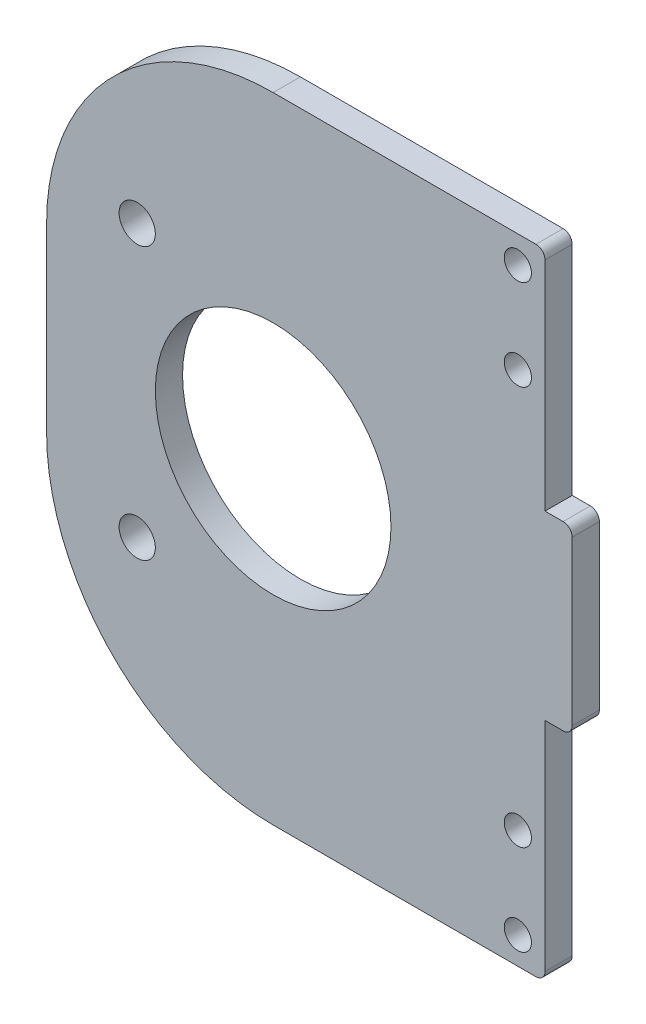
ISO-10303-21;
HEADER;
FILE_DESCRIPTION(('STEP AP214'),'2;1');
FILE_NAME('part.step','',(''),(''),'','','');
FILE_SCHEMA(('AUTOMOTIVE_DESIGN { 1 0 10303 214 1 1 1 1 }'));
ENDSEC;
DATA;
#1=APPLICATION_CONTEXT('core data for automotive mechanical design processes');
#2=APPLICATION_PROTOCOL_DEFINITION('international standard','automotive_design',2000,#1);
#3=PRODUCT_CONTEXT('',#1,'mechanical');
#4=PRODUCT('Part','Part','',(#3));
#5=PRODUCT_RELATED_PRODUCT_CATEGORY('part','',(#4));
#6=PRODUCT_DEFINITION_FORMATION('','',#4);
#7=PRODUCT_DEFINITION_CONTEXT('part definition',#1,'design');
#8=PRODUCT_DEFINITION('design','',#6,#7);
#9=PRODUCT_DEFINITION_SHAPE('','',#8);
#10=(LENGTH_UNIT() NAMED_UNIT(*) SI_UNIT(.MILLI.,.METRE.));
#11=(NAMED_UNIT(*) PLANE_ANGLE_UNIT() SI_UNIT($,.RADIAN.));
#12=(NAMED_UNIT(*) SI_UNIT($,.STERADIAN.) SOLID_ANGLE_UNIT());
#13=UNCERTAINTY_MEASURE_WITH_UNIT(LENGTH_MEASURE(1.E-05),#10,'distance_accuracy_value','');
#14=(GEOMETRIC_REPRESENTATION_CONTEXT(3) GLOBAL_UNCERTAINTY_ASSIGNED_CONTEXT((#13)) GLOBAL_UNIT_ASSIGNED_CONTEXT((#10,
#11,#12)) REPRESENTATION_CONTEXT('',''));
#15=CARTESIAN_POINT('',(0.,0.,0.));
#16=DIRECTION('',(0.,0.,1.));
#17=DIRECTION('',(1.,0.,0.));
#18=AXIS2_PLACEMENT_3D('',#15,#16,#17);
#19=CARTESIAN_POINT('',(27.5,-35.,3.));
#20=DIRECTION('',(-1.,0.,0.));
#21=DIRECTION('',(0.,0.,1.));
#22=AXIS2_PLACEMENT_3D('',#19,#20,#21);
#23=PLANE('',#22);
#24=DIRECTION('',(0.,1.,0.));
#25=VECTOR('',#24,1.);
#26=CARTESIAN_POINT('',(27.5,-35.,0.));
#27=LINE('',#26,#25);
#28=CARTESIAN_POINT('',(27.5,10.,0.));
#29=VERTEX_POINT('',#28);
#30=CARTESIAN_POINT('',(27.5,34.,0.));
#31=VERTEX_POINT('',#30);
#32=EDGE_CURVE('E168',#29,#31,#27,.T.);
#33=ORIENTED_EDGE('',*,*,#32,.T.);
#34=DIRECTION('',(0.,0.,-1.));
#35=VECTOR('',#34,1.);
#36=CARTESIAN_POINT('',(27.5,34.,3.));
#37=LINE('',#36,#35);
#38=CARTESIAN_POINT('',(27.5,34.,3.));
#39=VERTEX_POINT('',#38);
#40=EDGE_CURVE('E211',#31,#39,#37,.F.);
#41=ORIENTED_EDGE('',*,*,#40,.T.);
#42=DIRECTION('',(0.,1.,0.));
#43=VECTOR('',#42,1.);
#44=CARTESIAN_POINT('',(27.5,-35.,3.));
#45=LINE('',#44,#43);
#46=CARTESIAN_POINT('',(27.5,10.,3.));
#47=VERTEX_POINT('',#46);
#48=EDGE_CURVE('E169',#47,#39,#45,.T.);
#49=ORIENTED_EDGE('',*,*,#48,.F.);
#50=DIRECTION('',(0.,0.,1.));
#51=VECTOR('',#50,1.);
#52=CARTESIAN_POINT('',(27.5,10.,0.));
#53=LINE('',#52,#51);
#54=EDGE_CURVE('E152',#29,#47,#53,.T.);
#55=ORIENTED_EDGE('',*,*,#54,.F.);
#56=EDGE_LOOP('',(#33,#41,#49,#55));
#57=FACE_BOUND('',#56,.T.);
#58=ADVANCED_FACE('F44',(#57),#23,.F.);
#59=CARTESIAN_POINT('',(27.5,-34.,3.));
#60=VERTEX_POINT('',#59);
#61=CARTESIAN_POINT('',(27.5,-10.,3.));
#62=VERTEX_POINT('',#61);
#63=EDGE_CURVE('E298',#60,#62,#45,.T.);
#64=ORIENTED_EDGE('',*,*,#63,.F.);
#65=DIRECTION('',(0.,0.,-1.));
#66=VECTOR('',#65,1.);
#67=CARTESIAN_POINT('',(27.5,-34.,3.));
#68=LINE('',#67,#66);
#69=CARTESIAN_POINT('',(27.5,-34.,0.));
#70=VERTEX_POINT('',#69);
#71=EDGE_CURVE('E229',#60,#70,#68,.T.);
#72=ORIENTED_EDGE('',*,*,#71,.T.);
#73=CARTESIAN_POINT('',(27.5,-10.,0.));
#74=VERTEX_POINT('',#73);
#75=EDGE_CURVE('E178',#70,#74,#27,.T.);
#76=ORIENTED_EDGE('',*,*,#75,.T.);
#77=DIRECTION('',(0.,0.,1.));
#78=VECTOR('',#77,1.);
#79=CARTESIAN_POINT('',(27.5,-10.,0.));
#80=LINE('',#79,#78);
#81=EDGE_CURVE('E171',#74,#62,#80,.T.);
#82=ORIENTED_EDGE('',*,*,#81,.T.);
#83=EDGE_LOOP('',(#64,#72,#76,#82));
#84=FACE_BOUND('',#83,.T.);
#85=ADVANCED_FACE('F415',(#84),#23,.F.);
#86=CARTESIAN_POINT('',(-27.5,35.,3.));
#87=DIRECTION('',(0.,-1.,0.));
#88=DIRECTION('',(0.,0.,-1.));
#89=AXIS2_PLACEMENT_3D('',#86,#87,#88);
#90=PLANE('',#89);
#91=DIRECTION('',(-1.,0.,0.));
#92=VECTOR('',#91,1.);
#93=CARTESIAN_POINT('',(-27.5,35.,0.));
#94=LINE('',#93,#92);
#95=CARTESIAN_POINT('',(26.5,35.,0.));
#96=VERTEX_POINT('',#95);
#97=CARTESIAN_POINT('',(-2.5,35.,0.));
#98=VERTEX_POINT('',#97);
#99=EDGE_CURVE('E182',#96,#98,#94,.T.);
#100=ORIENTED_EDGE('',*,*,#99,.T.);
#101=DIRECTION('',(0.,0.,-1.));
#102=VECTOR('',#101,1.);
#103=CARTESIAN_POINT('',(-2.5,35.,3.));
#104=LINE('',#103,#102);
#105=CARTESIAN_POINT('',(-2.5,35.,3.));
#106=VERTEX_POINT('',#105);
#107=EDGE_CURVE('E11',#98,#106,#104,.F.);
#108=ORIENTED_EDGE('',*,*,#107,.T.);
#109=DIRECTION('',(-1.,0.,0.));
#110=VECTOR('',#109,1.);
#111=CARTESIAN_POINT('',(-27.5,35.,3.));
#112=LINE('',#111,#110);
#113=CARTESIAN_POINT('',(26.5,35.,3.));
#114=VERTEX_POINT('',#113);
#115=EDGE_CURVE('E287',#114,#106,#112,.T.);
#116=ORIENTED_EDGE('',*,*,#115,.F.);
#117=DIRECTION('',(0.,0.,-1.));
#118=VECTOR('',#117,1.);
#119=CARTESIAN_POINT('',(26.5,35.,3.));
#120=LINE('',#119,#118);
#121=EDGE_CURVE('E198',#114,#96,#120,.T.);
#122=ORIENTED_EDGE('',*,*,#121,.T.);
#123=EDGE_LOOP('',(#100,#108,#116,#122));
#124=FACE_BOUND('',#123,.T.);
#125=ADVANCED_FACE('F286',(#124),#90,.F.);
#126=CARTESIAN_POINT('',(-27.5,-35.,3.));
#127=DIRECTION('',(1.,0.,0.));
#128=DIRECTION('',(0.,0.,-1.));
#129=AXIS2_PLACEMENT_3D('',#126,#127,#128);
#130=PLANE('',#129);
#131=DIRECTION('',(0.,-1.,0.));
#132=VECTOR('',#131,1.);
#133=CARTESIAN_POINT('',(-27.5,-35.,0.));
#134=LINE('',#133,#132);
#135=CARTESIAN_POINT('',(-27.5,10.,0.));
#136=VERTEX_POINT('',#135);
#137=CARTESIAN_POINT('',(-27.5,-9.99999999999999,0.));
#138=VERTEX_POINT('',#137);
#139=EDGE_CURVE('E192',#136,#138,#134,.T.);
#140=ORIENTED_EDGE('',*,*,#139,.T.);
#141=DIRECTION('',(0.,0.,-1.));
#142=VECTOR('',#141,1.);
#143=CARTESIAN_POINT('',(-27.5,-9.99999999999999,3.));
#144=LINE('',#143,#142);
#145=CARTESIAN_POINT('',(-27.5,-9.99999999999999,3.));
#146=VERTEX_POINT('',#145);
#147=EDGE_CURVE('E70',#138,#146,#144,.F.);
#148=ORIENTED_EDGE('',*,*,#147,.T.);
#149=DIRECTION('',(0.,-1.,0.));
#150=VECTOR('',#149,1.);
#151=CARTESIAN_POINT('',(-27.5,-35.,3.));
#152=LINE('',#151,#150);
#153=CARTESIAN_POINT('',(-27.5,10.,3.));
#154=VERTEX_POINT('',#153);
#155=EDGE_CURVE('E274',#154,#146,#152,.T.);
#156=ORIENTED_EDGE('',*,*,#155,.F.);
#157=DIRECTION('',(0.,0.,-1.));
#158=VECTOR('',#157,1.);
#159=CARTESIAN_POINT('',(-27.5,10.,3.));
#160=LINE('',#159,#158);
#161=EDGE_CURVE('E261',#154,#136,#160,.T.);
#162=ORIENTED_EDGE('',*,*,#161,.T.);
#163=EDGE_LOOP('',(#140,#148,#156,#162));
#164=FACE_BOUND('',#163,.T.);
#165=ADVANCED_FACE('F283',(#164),#130,.F.);
#166=CARTESIAN_POINT('',(-27.5,-35.,3.));
#167=DIRECTION('',(0.,1.,0.));
#168=DIRECTION('',(0.,0.,1.));
#169=AXIS2_PLACEMENT_3D('',#166,#167,#168);
#170=PLANE('',#169);
#171=DIRECTION('',(1.,0.,0.));
#172=VECTOR('',#171,1.);
#173=CARTESIAN_POINT('',(-27.5,-35.,3.));
#174=LINE('',#173,#172);
#175=CARTESIAN_POINT('',(-2.5,-35.,3.));
#176=VERTEX_POINT('',#175);
#177=CARTESIAN_POINT('',(26.5,-35.,3.));
#178=VERTEX_POINT('',#177);
#179=EDGE_CURVE('E186',#176,#178,#174,.T.);
#180=ORIENTED_EDGE('',*,*,#179,.F.);
#181=DIRECTION('',(0.,0.,-1.));
#182=VECTOR('',#181,1.);
#183=CARTESIAN_POINT('',(-2.5,-35.,3.));
#184=LINE('',#183,#182);
#185=CARTESIAN_POINT('',(-2.5,-35.,0.));
#186=VERTEX_POINT('',#185);
#187=EDGE_CURVE('E252',#176,#186,#184,.T.);
#188=ORIENTED_EDGE('',*,*,#187,.T.);
#189=DIRECTION('',(1.,0.,0.));
#190=VECTOR('',#189,1.);
#191=CARTESIAN_POINT('',(-27.5,-35.,0.));
#192=LINE('',#191,#190);
#193=CARTESIAN_POINT('',(26.5,-35.,0.));
#194=VERTEX_POINT('',#193);
#195=EDGE_CURVE('E196',#186,#194,#192,.T.);
#196=ORIENTED_EDGE('',*,*,#195,.T.);
#197=DIRECTION('',(0.,0.,-1.));
#198=VECTOR('',#197,1.);
#199=CARTESIAN_POINT('',(26.5,-35.,3.));
#200=LINE('',#199,#198);
#201=EDGE_CURVE('E234',#194,#178,#200,.F.);
#202=ORIENTED_EDGE('',*,*,#201,.T.);
#203=EDGE_LOOP('',(#180,#188,#196,#202));
#204=FACE_BOUND('',#203,.T.);
#205=ADVANCED_FACE('F277',(#204),#170,.F.);
#206=CARTESIAN_POINT('',(0.,0.,3.));
#207=DIRECTION('',(0.,0.,-1.));
#208=DIRECTION('',(-1.,0.,0.));
#209=AXIS2_PLACEMENT_3D('',#206,#207,#208);
#210=PLANE('',#209);
#211=CARTESIAN_POINT('',(-17.5,15.,3.));
#212=DIRECTION('',(0.,0.,-1.));
#213=DIRECTION('',(-1.,0.,0.));
#214=AXIS2_PLACEMENT_3D('',#211,#212,#213);
#215=CIRCLE('',#214,2.);
#216=CARTESIAN_POINT('',(-19.5,15.,3.));
#217=VERTEX_POINT('',#216);
#218=EDGE_CURVE('E353',#217,#217,#215,.T.);
#219=ORIENTED_EDGE('',*,*,#218,.T.);
#220=EDGE_LOOP('',(#219));
#221=FACE_BOUND('',#220,.T.);
#222=CARTESIAN_POINT('',(-17.5,-15.,3.));
#223=DIRECTION('',(0.,0.,-1.));
#224=DIRECTION('',(1.,0.,0.));
#225=AXIS2_PLACEMENT_3D('',#222,#223,#224);
#226=CIRCLE('',#225,2.);
#227=CARTESIAN_POINT('',(-15.5,-15.,3.));
#228=VERTEX_POINT('',#227);
#229=EDGE_CURVE('E356',#228,#228,#226,.T.);
#230=ORIENTED_EDGE('',*,*,#229,.T.);
#231=EDGE_LOOP('',(#230));
#232=FACE_BOUND('',#231,.T.);
#233=CARTESIAN_POINT('',(24.5,32.,3.));
#234=DIRECTION('',(0.,0.,1.));
#235=DIRECTION('',(1.,0.,0.));
#236=AXIS2_PLACEMENT_3D('',#233,#234,#235);
#237=CIRCLE('',#236,1.5);
#238=CARTESIAN_POINT('',(26.,32.,3.));
#239=VERTEX_POINT('',#238);
#240=EDGE_CURVE('E333',#239,#239,#237,.T.);
#241=ORIENTED_EDGE('',*,*,#240,.F.);
#242=EDGE_LOOP('',(#241));
#243=FACE_BOUND('',#242,.T.);
#244=CARTESIAN_POINT('',(24.5,22.,3.));
#245=DIRECTION('',(0.,0.,1.));
#246=DIRECTION('',(1.,0.,0.));
#247=AXIS2_PLACEMENT_3D('',#244,#245,#246);
#248=CIRCLE('',#247,1.5);
#249=CARTESIAN_POINT('',(26.,22.,3.));
#250=VERTEX_POINT('',#249);
#251=EDGE_CURVE('E330',#250,#250,#248,.T.);
#252=ORIENTED_EDGE('',*,*,#251,.F.);
#253=EDGE_LOOP('',(#252));
#254=FACE_BOUND('',#253,.T.);
#255=CARTESIAN_POINT('',(24.5,-22.,3.));
#256=DIRECTION('',(0.,0.,1.));
#257=DIRECTION('',(-1.,0.,0.));
#258=AXIS2_PLACEMENT_3D('',#255,#256,#257);
#259=CIRCLE('',#258,1.5);
#260=CARTESIAN_POINT('',(23.,-22.,3.));
#261=VERTEX_POINT('',#260);
#262=EDGE_CURVE('E316',#261,#261,#259,.T.);
#263=ORIENTED_EDGE('',*,*,#262,.F.);
#264=EDGE_LOOP('',(#263));
#265=FACE_BOUND('',#264,.T.);
#266=CARTESIAN_POINT('',(24.5,-32.,3.));
#267=DIRECTION('',(0.,0.,1.));
#268=DIRECTION('',(-1.,0.,0.));
#269=AXIS2_PLACEMENT_3D('',#266,#267,#268);
#270=CIRCLE('',#269,1.5);
#271=CARTESIAN_POINT('',(23.,-32.,3.));
#272=VERTEX_POINT('',#271);
#273=EDGE_CURVE('E311',#272,#272,#270,.T.);
#274=ORIENTED_EDGE('',*,*,#273,.F.);
#275=EDGE_LOOP('',(#274));
#276=FACE_BOUND('',#275,.T.);
#277=CARTESIAN_POINT('',(-2.49999999999999,0.,3.));
#278=DIRECTION('',(0.,0.,-1.));
#279=DIRECTION('',(-1.,0.,0.));
#280=AXIS2_PLACEMENT_3D('',#277,#278,#279);
#281=CIRCLE('',#280,13.);
#282=CARTESIAN_POINT('',(-15.5,0.,3.));
#283=VERTEX_POINT('',#282);
#284=EDGE_CURVE('E177',#283,#283,#281,.T.);
#285=ORIENTED_EDGE('',*,*,#284,.T.);
#286=EDGE_LOOP('',(#285));
#287=FACE_BOUND('',#286,.T.);
#288=ORIENTED_EDGE('',*,*,#155,.T.);
#289=CARTESIAN_POINT('',(-2.5,-9.99999999999999,3.));
#290=DIRECTION('',(0.,0.,-1.));
#291=DIRECTION('',(-1.,0.,0.));
#292=AXIS2_PLACEMENT_3D('',#289,#290,#291);
#293=CIRCLE('',#292,25.);
#294=EDGE_CURVE('E53',#146,#176,#293,.F.);
#295=ORIENTED_EDGE('',*,*,#294,.T.);
#296=ORIENTED_EDGE('',*,*,#179,.T.);
#297=CARTESIAN_POINT('',(26.5,-34.,3.));
#298=DIRECTION('',(0.,0.,-1.));
#299=DIRECTION('',(-1.,0.,0.));
#300=AXIS2_PLACEMENT_3D('',#297,#298,#299);
#301=CIRCLE('',#300,1.);
#302=EDGE_CURVE('E224',#178,#60,#301,.F.);
#303=ORIENTED_EDGE('',*,*,#302,.T.);
#304=ORIENTED_EDGE('',*,*,#63,.T.);
#305=DIRECTION('',(1.,0.,0.));
#306=VECTOR('',#305,1.);
#307=CARTESIAN_POINT('',(27.5,-10.,3.));
#308=LINE('',#307,#306);
#309=CARTESIAN_POINT('',(29.5,-10.,3.));
#310=VERTEX_POINT('',#309);
#311=EDGE_CURVE('E343',#62,#310,#308,.T.);
#312=ORIENTED_EDGE('',*,*,#311,.T.);
#313=CARTESIAN_POINT('',(29.5,-9.,3.));
#314=DIRECTION('',(0.,0.,-1.));
#315=DIRECTION('',(-1.,0.,0.));
#316=AXIS2_PLACEMENT_3D('',#313,#314,#315);
#317=CIRCLE('',#316,1.);
#318=CARTESIAN_POINT('',(30.5,-9.,3.));
#319=VERTEX_POINT('',#318);
#320=EDGE_CURVE('E217',#310,#319,#317,.F.);
#321=ORIENTED_EDGE('',*,*,#320,.T.);
#322=DIRECTION('',(0.,1.,0.));
#323=VECTOR('',#322,1.);
#324=CARTESIAN_POINT('',(30.5,-10.,3.));
#325=LINE('',#324,#323);
#326=CARTESIAN_POINT('',(30.5,9.,3.));
#327=VERTEX_POINT('',#326);
#328=EDGE_CURVE('E350',#319,#327,#325,.T.);
#329=ORIENTED_EDGE('',*,*,#328,.T.);
#330=CARTESIAN_POINT('',(29.5,9.,3.));
#331=DIRECTION('',(0.,0.,-1.));
#332=DIRECTION('',(-1.,0.,0.));
#333=AXIS2_PLACEMENT_3D('',#330,#331,#332);
#334=CIRCLE('',#333,1.);
#335=CARTESIAN_POINT('',(29.5,10.,3.));
#336=VERTEX_POINT('',#335);
#337=EDGE_CURVE('E223',#327,#336,#334,.F.);
#338=ORIENTED_EDGE('',*,*,#337,.T.);
#339=DIRECTION('',(-1.,0.,0.));
#340=VECTOR('',#339,1.);
#341=CARTESIAN_POINT('',(27.5,10.,3.));
#342=LINE('',#341,#340);
#343=EDGE_CURVE('E295',#336,#47,#342,.T.);
#344=ORIENTED_EDGE('',*,*,#343,.T.);
#345=ORIENTED_EDGE('',*,*,#48,.T.);
#346=CARTESIAN_POINT('',(26.5,34.,3.));
#347=DIRECTION('',(0.,0.,-1.));
#348=DIRECTION('',(-1.,0.,0.));
#349=AXIS2_PLACEMENT_3D('',#346,#347,#348);
#350=CIRCLE('',#349,1.);
#351=EDGE_CURVE('E227',#39,#114,#350,.F.);
#352=ORIENTED_EDGE('',*,*,#351,.T.);
#353=ORIENTED_EDGE('',*,*,#115,.T.);
#354=CARTESIAN_POINT('',(-2.5,10.,3.));
#355=DIRECTION('',(0.,0.,-1.));
#356=DIRECTION('',(-1.,0.,0.));
#357=AXIS2_PLACEMENT_3D('',#354,#355,#356);
#358=CIRCLE('',#357,25.);
#359=EDGE_CURVE('E270',#106,#154,#358,.F.);
#360=ORIENTED_EDGE('',*,*,#359,.T.);
#361=EDGE_LOOP('',(#288,#295,#296,#303,#304,#312,#321,#329,#338,#344,#345,#352,#353,#360));
#362=FACE_BOUND('',#361,.T.);
#363=ADVANCED_FACE('F271',(#221,#232,#243,#254,#265,#276,#287,#362),#210,.F.);
#364=CARTESIAN_POINT('',(0.,0.,0.));
#365=DIRECTION('',(0.,0.,-1.));
#366=DIRECTION('',(-1.,0.,0.));
#367=AXIS2_PLACEMENT_3D('',#364,#365,#366);
#368=PLANE('',#367);
#369=CARTESIAN_POINT('',(-17.5,15.,0.));
#370=DIRECTION('',(0.,0.,-1.));
#371=DIRECTION('',(-1.,0.,0.));
#372=AXIS2_PLACEMENT_3D('',#369,#370,#371);
#373=CIRCLE('',#372,2.);
#374=CARTESIAN_POINT('',(-19.5,15.,0.));
#375=VERTEX_POINT('',#374);
#376=EDGE_CURVE('E366',#375,#375,#373,.T.);
#377=ORIENTED_EDGE('',*,*,#376,.F.);
#378=EDGE_LOOP('',(#377));
#379=FACE_BOUND('',#378,.T.);
#380=CARTESIAN_POINT('',(-17.5,-15.,0.));
#381=DIRECTION('',(0.,0.,-1.));
#382=DIRECTION('',(1.,0.,0.));
#383=AXIS2_PLACEMENT_3D('',#380,#381,#382);
#384=CIRCLE('',#383,2.);
#385=CARTESIAN_POINT('',(-15.5,-15.,0.));
#386=VERTEX_POINT('',#385);
#387=EDGE_CURVE('E365',#386,#386,#384,.T.);
#388=ORIENTED_EDGE('',*,*,#387,.F.);
#389=EDGE_LOOP('',(#388));
#390=FACE_BOUND('',#389,.T.);
#391=CARTESIAN_POINT('',(24.5,32.,0.));
#392=DIRECTION('',(0.,0.,1.));
#393=DIRECTION('',(1.,0.,0.));
#394=AXIS2_PLACEMENT_3D('',#391,#392,#393);
#395=CIRCLE('',#394,1.5);
#396=CARTESIAN_POINT('',(26.,32.,0.));
#397=VERTEX_POINT('',#396);
#398=EDGE_CURVE('E304',#397,#397,#395,.T.);
#399=ORIENTED_EDGE('',*,*,#398,.T.);
#400=EDGE_LOOP('',(#399));
#401=FACE_BOUND('',#400,.T.);
#402=CARTESIAN_POINT('',(24.5,22.,0.));
#403=DIRECTION('',(0.,0.,1.));
#404=DIRECTION('',(1.,0.,0.));
#405=AXIS2_PLACEMENT_3D('',#402,#403,#404);
#406=CIRCLE('',#405,1.5);
#407=CARTESIAN_POINT('',(26.,22.,0.));
#408=VERTEX_POINT('',#407);
#409=EDGE_CURVE('E322',#408,#408,#406,.T.);
#410=ORIENTED_EDGE('',*,*,#409,.T.);
#411=EDGE_LOOP('',(#410));
#412=FACE_BOUND('',#411,.T.);
#413=CARTESIAN_POINT('',(24.5,-22.,0.));
#414=DIRECTION('',(0.,0.,1.));
#415=DIRECTION('',(-1.,0.,0.));
#416=AXIS2_PLACEMENT_3D('',#413,#414,#415);
#417=CIRCLE('',#416,1.5);
#418=CARTESIAN_POINT('',(23.,-22.,0.));
#419=VERTEX_POINT('',#418);
#420=EDGE_CURVE('E314',#419,#419,#417,.T.);
#421=ORIENTED_EDGE('',*,*,#420,.T.);
#422=EDGE_LOOP('',(#421));
#423=FACE_BOUND('',#422,.T.);
#424=CARTESIAN_POINT('',(24.5,-32.,0.));
#425=DIRECTION('',(0.,0.,1.));
#426=DIRECTION('',(-1.,0.,0.));
#427=AXIS2_PLACEMENT_3D('',#424,#425,#426);
#428=CIRCLE('',#427,1.5);
#429=CARTESIAN_POINT('',(23.,-32.,0.));
#430=VERTEX_POINT('',#429);
#431=EDGE_CURVE('E310',#430,#430,#428,.T.);
#432=ORIENTED_EDGE('',*,*,#431,.T.);
#433=EDGE_LOOP('',(#432));
#434=FACE_BOUND('',#433,.T.);
#435=CARTESIAN_POINT('',(-2.49999999999999,0.,0.));
#436=DIRECTION('',(0.,0.,-1.));
#437=DIRECTION('',(-1.,0.,0.));
#438=AXIS2_PLACEMENT_3D('',#435,#436,#437);
#439=CIRCLE('',#438,13.);
#440=CARTESIAN_POINT('',(-15.5,0.,0.));
#441=VERTEX_POINT('',#440);
#442=EDGE_CURVE('E184',#441,#441,#439,.T.);
#443=ORIENTED_EDGE('',*,*,#442,.F.);
#444=EDGE_LOOP('',(#443));
#445=FACE_BOUND('',#444,.T.);
#446=ORIENTED_EDGE('',*,*,#195,.F.);
#447=CARTESIAN_POINT('',(-2.5,-9.99999999999999,0.));
#448=DIRECTION('',(0.,0.,-1.));
#449=DIRECTION('',(-1.,0.,0.));
#450=AXIS2_PLACEMENT_3D('',#447,#448,#449);
#451=CIRCLE('',#450,25.);
#452=EDGE_CURVE('E257',#186,#138,#451,.T.);
#453=ORIENTED_EDGE('',*,*,#452,.T.);
#454=ORIENTED_EDGE('',*,*,#139,.F.);
#455=CARTESIAN_POINT('',(-2.5,10.,0.));
#456=DIRECTION('',(0.,0.,-1.));
#457=DIRECTION('',(-1.,0.,0.));
#458=AXIS2_PLACEMENT_3D('',#455,#456,#457);
#459=CIRCLE('',#458,25.);
#460=EDGE_CURVE('E253',#136,#98,#459,.T.);
#461=ORIENTED_EDGE('',*,*,#460,.T.);
#462=ORIENTED_EDGE('',*,*,#99,.F.);
#463=CARTESIAN_POINT('',(26.5,34.,0.));
#464=DIRECTION('',(0.,0.,-1.));
#465=DIRECTION('',(-1.,0.,0.));
#466=AXIS2_PLACEMENT_3D('',#463,#464,#465);
#467=CIRCLE('',#466,1.);
#468=EDGE_CURVE('E176',#96,#31,#467,.T.);
#469=ORIENTED_EDGE('',*,*,#468,.T.);
#470=ORIENTED_EDGE('',*,*,#32,.F.);
#471=DIRECTION('',(-1.,0.,0.));
#472=VECTOR('',#471,1.);
#473=CARTESIAN_POINT('',(27.5,10.,0.));
#474=LINE('',#473,#472);
#475=CARTESIAN_POINT('',(29.5,10.,0.));
#476=VERTEX_POINT('',#475);
#477=EDGE_CURVE('E150',#476,#29,#474,.T.);
#478=ORIENTED_EDGE('',*,*,#477,.F.);
#479=CARTESIAN_POINT('',(29.5,9.,0.));
#480=DIRECTION('',(0.,0.,-1.));
#481=DIRECTION('',(-1.,0.,0.));
#482=AXIS2_PLACEMENT_3D('',#479,#480,#481);
#483=CIRCLE('',#482,1.);
#484=CARTESIAN_POINT('',(30.5,9.,0.));
#485=VERTEX_POINT('',#484);
#486=EDGE_CURVE('E207',#476,#485,#483,.T.);
#487=ORIENTED_EDGE('',*,*,#486,.T.);
#488=DIRECTION('',(0.,1.,0.));
#489=VECTOR('',#488,1.);
#490=CARTESIAN_POINT('',(30.5,-10.,0.));
#491=LINE('',#490,#489);
#492=CARTESIAN_POINT('',(30.5,-9.,0.));
#493=VERTEX_POINT('',#492);
#494=EDGE_CURVE('E162',#493,#485,#491,.T.);
#495=ORIENTED_EDGE('',*,*,#494,.F.);
#496=CARTESIAN_POINT('',(29.5,-9.,0.));
#497=DIRECTION('',(0.,0.,-1.));
#498=DIRECTION('',(-1.,0.,0.));
#499=AXIS2_PLACEMENT_3D('',#496,#497,#498);
#500=CIRCLE('',#499,1.);
#501=CARTESIAN_POINT('',(29.5,-10.,0.));
#502=VERTEX_POINT('',#501);
#503=EDGE_CURVE('E201',#493,#502,#500,.T.);
#504=ORIENTED_EDGE('',*,*,#503,.T.);
#505=DIRECTION('',(1.,0.,0.));
#506=VECTOR('',#505,1.);
#507=CARTESIAN_POINT('',(27.5,-10.,0.));
#508=LINE('',#507,#506);
#509=EDGE_CURVE('E163',#74,#502,#508,.T.);
#510=ORIENTED_EDGE('',*,*,#509,.F.);
#511=ORIENTED_EDGE('',*,*,#75,.F.);
#512=CARTESIAN_POINT('',(26.5,-34.,0.));
#513=DIRECTION('',(0.,0.,-1.));
#514=DIRECTION('',(-1.,0.,0.));
#515=AXIS2_PLACEMENT_3D('',#512,#513,#514);
#516=CIRCLE('',#515,1.);
#517=EDGE_CURVE('E209',#70,#194,#516,.T.);
#518=ORIENTED_EDGE('',*,*,#517,.T.);
#519=EDGE_LOOP('',(#446,#453,#454,#461,#462,#469,#470,#478,#487,#495,#504,#510,#511,#518));
#520=FACE_BOUND('',#519,.T.);
#521=ADVANCED_FACE('F172',(#379,#390,#401,#412,#423,#434,#445,#520),#368,.T.);
#522=CARTESIAN_POINT('',(-2.49999999999999,0.,3.));
#523=DIRECTION('',(0.,0.,-1.));
#524=DIRECTION('',(-1.,0.,0.));
#525=AXIS2_PLACEMENT_3D('',#522,#523,#524);
#526=CYLINDRICAL_SURFACE('',#525,13.);
#527=ORIENTED_EDGE('',*,*,#284,.F.);
#528=EDGE_LOOP('',(#527));
#529=FACE_BOUND('',#528,.T.);
#530=ORIENTED_EDGE('',*,*,#442,.T.);
#531=EDGE_LOOP('',(#530));
#532=FACE_BOUND('',#531,.T.);
#533=ADVANCED_FACE('F383',(#529,#532),#526,.F.);
#534=CARTESIAN_POINT('',(24.5,-32.,0.));
#535=DIRECTION('',(0.,0.,1.));
#536=DIRECTION('',(1.,0.,0.));
#537=AXIS2_PLACEMENT_3D('',#534,#535,#536);
#538=CYLINDRICAL_SURFACE('',#537,1.5);
#539=ORIENTED_EDGE('',*,*,#431,.F.);
#540=EDGE_LOOP('',(#539));
#541=FACE_BOUND('',#540,.T.);
#542=ORIENTED_EDGE('',*,*,#273,.T.);
#543=EDGE_LOOP('',(#542));
#544=FACE_BOUND('',#543,.T.);
#545=ADVANCED_FACE('F397',(#541,#544),#538,.F.);
#546=CARTESIAN_POINT('',(24.5,-22.,0.));
#547=DIRECTION('',(0.,0.,1.));
#548=DIRECTION('',(1.,0.,0.));
#549=AXIS2_PLACEMENT_3D('',#546,#547,#548);
#550=CYLINDRICAL_SURFACE('',#549,1.5);
#551=ORIENTED_EDGE('',*,*,#420,.F.);
#552=EDGE_LOOP('',(#551));
#553=FACE_BOUND('',#552,.T.);
#554=ORIENTED_EDGE('',*,*,#262,.T.);
#555=EDGE_LOOP('',(#554));
#556=FACE_BOUND('',#555,.T.);
#557=ADVANCED_FACE('F408',(#553,#556),#550,.F.);
#558=CARTESIAN_POINT('',(24.5,22.,0.));
#559=DIRECTION('',(0.,0.,1.));
#560=DIRECTION('',(1.,0.,0.));
#561=AXIS2_PLACEMENT_3D('',#558,#559,#560);
#562=CYLINDRICAL_SURFACE('',#561,1.5);
#563=ORIENTED_EDGE('',*,*,#409,.F.);
#564=EDGE_LOOP('',(#563));
#565=FACE_BOUND('',#564,.T.);
#566=ORIENTED_EDGE('',*,*,#251,.T.);
#567=EDGE_LOOP('',(#566));
#568=FACE_BOUND('',#567,.T.);
#569=ADVANCED_FACE('F461',(#565,#568),#562,.F.);
#570=CARTESIAN_POINT('',(24.5,32.,0.));
#571=DIRECTION('',(0.,0.,1.));
#572=DIRECTION('',(1.,0.,0.));
#573=AXIS2_PLACEMENT_3D('',#570,#571,#572);
#574=CYLINDRICAL_SURFACE('',#573,1.5);
#575=ORIENTED_EDGE('',*,*,#398,.F.);
#576=EDGE_LOOP('',(#575));
#577=FACE_BOUND('',#576,.T.);
#578=ORIENTED_EDGE('',*,*,#240,.T.);
#579=EDGE_LOOP('',(#578));
#580=FACE_BOUND('',#579,.T.);
#581=ADVANCED_FACE('F459',(#577,#580),#574,.F.);
#582=CARTESIAN_POINT('',(30.5,-10.,0.));
#583=DIRECTION('',(1.,0.,0.));
#584=DIRECTION('',(0.,0.,-1.));
#585=AXIS2_PLACEMENT_3D('',#582,#583,#584);
#586=PLANE('',#585);
#587=ORIENTED_EDGE('',*,*,#494,.T.);
#588=DIRECTION('',(0.,0.,1.));
#589=VECTOR('',#588,1.);
#590=CARTESIAN_POINT('',(30.5,9.,0.));
#591=LINE('',#590,#589);
#592=EDGE_CURVE('E241',#485,#327,#591,.T.);
#593=ORIENTED_EDGE('',*,*,#592,.T.);
#594=ORIENTED_EDGE('',*,*,#328,.F.);
#595=DIRECTION('',(0.,0.,1.));
#596=VECTOR('',#595,1.);
#597=CARTESIAN_POINT('',(30.5,-9.,0.));
#598=LINE('',#597,#596);
#599=EDGE_CURVE('E238',#319,#493,#598,.F.);
#600=ORIENTED_EDGE('',*,*,#599,.T.);
#601=EDGE_LOOP('',(#587,#593,#594,#600));
#602=FACE_BOUND('',#601,.T.);
#603=ADVANCED_FACE('F455',(#602),#586,.T.);
#604=CARTESIAN_POINT('',(27.5,-10.,0.));
#605=DIRECTION('',(0.,-1.,0.));
#606=DIRECTION('',(0.,0.,-1.));
#607=AXIS2_PLACEMENT_3D('',#604,#605,#606);
#608=PLANE('',#607);
#609=ORIENTED_EDGE('',*,*,#509,.T.);
#610=DIRECTION('',(0.,0.,1.));
#611=VECTOR('',#610,1.);
#612=CARTESIAN_POINT('',(29.5,-10.,0.));
#613=LINE('',#612,#611);
#614=EDGE_CURVE('E250',#502,#310,#613,.T.);
#615=ORIENTED_EDGE('',*,*,#614,.T.);
#616=ORIENTED_EDGE('',*,*,#311,.F.);
#617=ORIENTED_EDGE('',*,*,#81,.F.);
#618=EDGE_LOOP('',(#609,#615,#616,#617));
#619=FACE_BOUND('',#618,.T.);
#620=ADVANCED_FACE('F453',(#619),#608,.T.);
#621=CARTESIAN_POINT('',(27.5,10.,0.));
#622=DIRECTION('',(0.,1.,0.));
#623=DIRECTION('',(0.,0.,1.));
#624=AXIS2_PLACEMENT_3D('',#621,#622,#623);
#625=PLANE('',#624);
#626=ORIENTED_EDGE('',*,*,#343,.F.);
#627=DIRECTION('',(0.,0.,1.));
#628=VECTOR('',#627,1.);
#629=CARTESIAN_POINT('',(29.5,10.,0.));
#630=LINE('',#629,#628);
#631=EDGE_CURVE('E158',#336,#476,#630,.F.);
#632=ORIENTED_EDGE('',*,*,#631,.T.);
#633=ORIENTED_EDGE('',*,*,#477,.T.);
#634=ORIENTED_EDGE('',*,*,#54,.T.);
#635=EDGE_LOOP('',(#626,#632,#633,#634));
#636=FACE_BOUND('',#635,.T.);
#637=ADVANCED_FACE('F155',(#636),#625,.T.);
#638=CARTESIAN_POINT('',(26.5,34.,3.));
#639=DIRECTION('',(0.,0.,-1.));
#640=DIRECTION('',(-1.,0.,0.));
#641=AXIS2_PLACEMENT_3D('',#638,#639,#640);
#642=CYLINDRICAL_SURFACE('',#641,1.);
#643=ORIENTED_EDGE('',*,*,#351,.F.);
#644=ORIENTED_EDGE('',*,*,#40,.F.);
#645=ORIENTED_EDGE('',*,*,#468,.F.);
#646=ORIENTED_EDGE('',*,*,#121,.F.);
#647=EDGE_LOOP('',(#643,#644,#645,#646));
#648=FACE_BOUND('',#647,.T.);
#649=ADVANCED_FACE('F291',(#648),#642,.T.);
#650=CARTESIAN_POINT('',(26.5,-34.,3.));
#651=DIRECTION('',(0.,0.,-1.));
#652=DIRECTION('',(-1.,0.,0.));
#653=AXIS2_PLACEMENT_3D('',#650,#651,#652);
#654=CYLINDRICAL_SURFACE('',#653,1.);
#655=ORIENTED_EDGE('',*,*,#302,.F.);
#656=ORIENTED_EDGE('',*,*,#201,.F.);
#657=ORIENTED_EDGE('',*,*,#517,.F.);
#658=ORIENTED_EDGE('',*,*,#71,.F.);
#659=EDGE_LOOP('',(#655,#656,#657,#658));
#660=FACE_BOUND('',#659,.T.);
#661=ADVANCED_FACE('F425',(#660),#654,.T.);
#662=CARTESIAN_POINT('',(29.5,9.,0.));
#663=DIRECTION('',(0.,0.,1.));
#664=DIRECTION('',(1.,0.,0.));
#665=AXIS2_PLACEMENT_3D('',#662,#663,#664);
#666=CYLINDRICAL_SURFACE('',#665,1.);
#667=ORIENTED_EDGE('',*,*,#486,.F.);
#668=ORIENTED_EDGE('',*,*,#631,.F.);
#669=ORIENTED_EDGE('',*,*,#337,.F.);
#670=ORIENTED_EDGE('',*,*,#592,.F.);
#671=EDGE_LOOP('',(#667,#668,#669,#670));
#672=FACE_BOUND('',#671,.T.);
#673=ADVANCED_FACE('F430',(#672),#666,.T.);
#674=CARTESIAN_POINT('',(29.5,-9.,0.));
#675=DIRECTION('',(0.,0.,1.));
#676=DIRECTION('',(1.,0.,0.));
#677=AXIS2_PLACEMENT_3D('',#674,#675,#676);
#678=CYLINDRICAL_SURFACE('',#677,1.);
#679=ORIENTED_EDGE('',*,*,#503,.F.);
#680=ORIENTED_EDGE('',*,*,#599,.F.);
#681=ORIENTED_EDGE('',*,*,#320,.F.);
#682=ORIENTED_EDGE('',*,*,#614,.F.);
#683=EDGE_LOOP('',(#679,#680,#681,#682));
#684=FACE_BOUND('',#683,.T.);
#685=ADVANCED_FACE('F431',(#684),#678,.T.);
#686=CARTESIAN_POINT('',(-2.5,-9.99999999999999,3.));
#687=DIRECTION('',(0.,0.,-1.));
#688=DIRECTION('',(-1.,0.,0.));
#689=AXIS2_PLACEMENT_3D('',#686,#687,#688);
#690=CYLINDRICAL_SURFACE('',#689,25.);
#691=ORIENTED_EDGE('',*,*,#294,.F.);
#692=ORIENTED_EDGE('',*,*,#147,.F.);
#693=ORIENTED_EDGE('',*,*,#452,.F.);
#694=ORIENTED_EDGE('',*,*,#187,.F.);
#695=EDGE_LOOP('',(#691,#692,#693,#694));
#696=FACE_BOUND('',#695,.T.);
#697=ADVANCED_FACE('F285',(#696),#690,.T.);
#698=CARTESIAN_POINT('',(-2.5,10.,3.));
#699=DIRECTION('',(0.,0.,-1.));
#700=DIRECTION('',(-1.,0.,0.));
#701=AXIS2_PLACEMENT_3D('',#698,#699,#700);
#702=CYLINDRICAL_SURFACE('',#701,25.);
#703=ORIENTED_EDGE('',*,*,#359,.F.);
#704=ORIENTED_EDGE('',*,*,#107,.F.);
#705=ORIENTED_EDGE('',*,*,#460,.F.);
#706=ORIENTED_EDGE('',*,*,#161,.F.);
#707=EDGE_LOOP('',(#703,#704,#705,#706));
#708=FACE_BOUND('',#707,.T.);
#709=ADVANCED_FACE('F50',(#708),#702,.T.);
#710=CARTESIAN_POINT('',(-17.5,-15.,3.));
#711=DIRECTION('',(0.,0.,-1.));
#712=DIRECTION('',(-1.,0.,0.));
#713=AXIS2_PLACEMENT_3D('',#710,#711,#712);
#714=CYLINDRICAL_SURFACE('',#713,2.);
#715=ORIENTED_EDGE('',*,*,#229,.F.);
#716=EDGE_LOOP('',(#715));
#717=FACE_BOUND('',#716,.T.);
#718=ORIENTED_EDGE('',*,*,#387,.T.);
#719=EDGE_LOOP('',(#718));
#720=FACE_BOUND('',#719,.T.);
#721=ADVANCED_FACE('F378',(#717,#720),#714,.F.);
#722=CARTESIAN_POINT('',(-17.5,15.,3.));
#723=DIRECTION('',(0.,0.,-1.));
#724=DIRECTION('',(-1.,0.,0.));
#725=AXIS2_PLACEMENT_3D('',#722,#723,#724);
#726=CYLINDRICAL_SURFACE('',#725,2.);
#727=ORIENTED_EDGE('',*,*,#218,.F.);
#728=EDGE_LOOP('',(#727));
#729=FACE_BOUND('',#728,.T.);
#730=ORIENTED_EDGE('',*,*,#376,.T.);
#731=EDGE_LOOP('',(#730));
#732=FACE_BOUND('',#731,.T.);
#733=ADVANCED_FACE('F376',(#729,#732),#726,.F.);
#734=CLOSED_SHELL('',(#58,#85,#125,#165,#205,#363,#521,#533,#545,#557,#569,#581,#603,#620,#637,
#649,#661,#673,#685,#697,#709,#721,#733));
#735=MANIFOLD_SOLID_BREP('B2',#734);
#736=ADVANCED_BREP_SHAPE_REPRESENTATION('',(#18,#735),#14);
#737=SHAPE_DEFINITION_REPRESENTATION(#9,#736);
ENDSEC;
END-ISO-10303-21;
